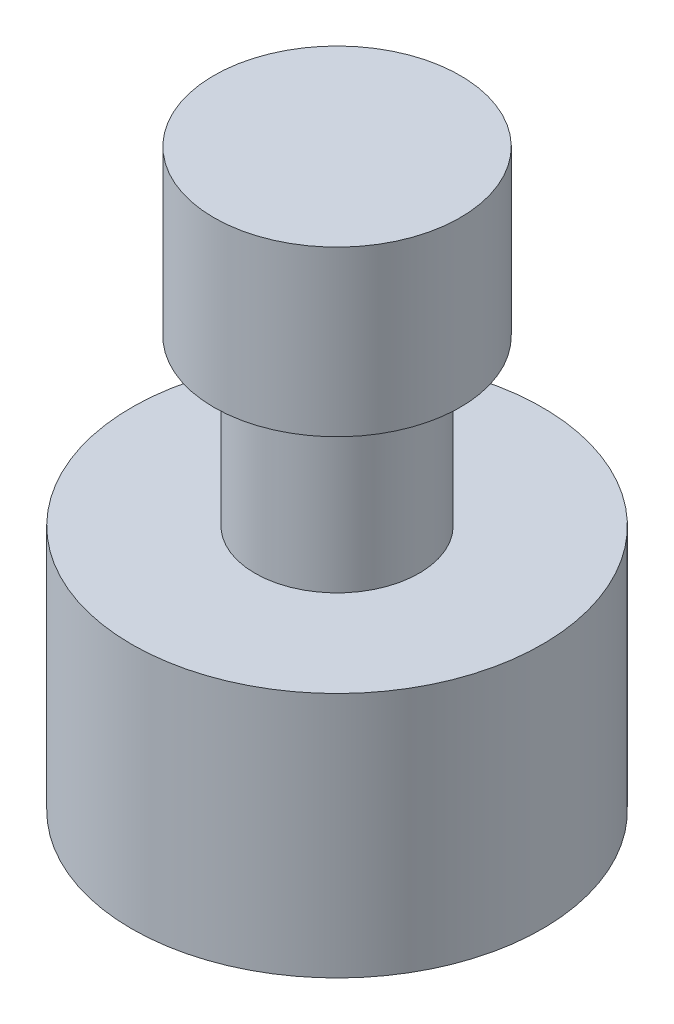
ISO-10303-21;
HEADER;
FILE_DESCRIPTION(('STEP AP214'),'2;1');
FILE_NAME('part.step','',(''),(''),'','','');
FILE_SCHEMA(('AUTOMOTIVE_DESIGN { 1 0 10303 214 1 1 1 1 }'));
ENDSEC;
DATA;
#1=APPLICATION_CONTEXT('core data for automotive mechanical design processes');
#2=APPLICATION_PROTOCOL_DEFINITION('international standard','automotive_design',2000,#1);
#3=PRODUCT_CONTEXT('',#1,'mechanical');
#4=PRODUCT('Part','Part','',(#3));
#5=PRODUCT_RELATED_PRODUCT_CATEGORY('part','',(#4));
#6=PRODUCT_DEFINITION_FORMATION('','',#4);
#7=PRODUCT_DEFINITION_CONTEXT('part definition',#1,'design');
#8=PRODUCT_DEFINITION('design','',#6,#7);
#9=PRODUCT_DEFINITION_SHAPE('','',#8);
#10=(LENGTH_UNIT() NAMED_UNIT(*) SI_UNIT(.MILLI.,.METRE.));
#11=(NAMED_UNIT(*) PLANE_ANGLE_UNIT() SI_UNIT($,.RADIAN.));
#12=(NAMED_UNIT(*) SI_UNIT($,.STERADIAN.) SOLID_ANGLE_UNIT());
#13=UNCERTAINTY_MEASURE_WITH_UNIT(LENGTH_MEASURE(1.E-05),#10,'distance_accuracy_value','');
#14=(GEOMETRIC_REPRESENTATION_CONTEXT(3) GLOBAL_UNCERTAINTY_ASSIGNED_CONTEXT((#13)) GLOBAL_UNIT_ASSIGNED_CONTEXT((#10,
#11,#12)) REPRESENTATION_CONTEXT('',''));
#15=CARTESIAN_POINT('',(0.,0.,0.));
#16=DIRECTION('',(0.,0.,1.));
#17=DIRECTION('',(1.,0.,0.));
#18=AXIS2_PLACEMENT_3D('',#15,#16,#17);
#19=CARTESIAN_POINT('',(0.,70.,0.));
#20=DIRECTION('',(0.,-1.,0.));
#21=DIRECTION('',(0.,0.,-1.));
#22=AXIS2_PLACEMENT_3D('',#19,#20,#21);
#23=PLANE('',#22);
#24=CARTESIAN_POINT('',(25.,70.,0.));
#25=DIRECTION('',(0.,1.,0.));
#26=DIRECTION('',(0.,0.,1.));
#27=AXIS2_PLACEMENT_3D('',#24,#25,#26);
#28=CIRCLE('',#27,15.);
#29=CARTESIAN_POINT('',(25.,70.,15.));
#30=VERTEX_POINT('',#29);
#31=EDGE_CURVE('E10',#30,#30,#28,.T.);
#32=ORIENTED_EDGE('',*,*,#31,.T.);
#33=EDGE_LOOP('',(#32));
#34=FACE_BOUND('',#33,.T.);
#35=ADVANCED_FACE('F37',(#34),#23,.F.);
#36=CARTESIAN_POINT('',(25.,70.,0.));
#37=DIRECTION('',(0.,1.,0.));
#38=DIRECTION('',(0.,0.,1.));
#39=AXIS2_PLACEMENT_3D('',#36,#37,#38);
#40=CYLINDRICAL_SURFACE('',#39,15.);
#41=ORIENTED_EDGE('',*,*,#31,.F.);
#42=EDGE_LOOP('',(#41));
#43=FACE_BOUND('',#42,.T.);
#44=CARTESIAN_POINT('',(25.,50.,0.));
#45=DIRECTION('',(0.,1.,0.));
#46=DIRECTION('',(0.,0.,1.));
#47=AXIS2_PLACEMENT_3D('',#44,#45,#46);
#48=CIRCLE('',#47,15.);
#49=CARTESIAN_POINT('',(25.,50.,15.));
#50=VERTEX_POINT('',#49);
#51=EDGE_CURVE('E43',#50,#50,#48,.T.);
#52=ORIENTED_EDGE('',*,*,#51,.T.);
#53=EDGE_LOOP('',(#52));
#54=FACE_BOUND('',#53,.T.);
#55=ADVANCED_FACE('F75',(#43,#54),#40,.T.);
#56=CARTESIAN_POINT('',(0.,50.,0.));
#57=DIRECTION('',(0.,-1.,0.));
#58=DIRECTION('',(0.,0.,-1.));
#59=AXIS2_PLACEMENT_3D('',#56,#57,#58);
#60=PLANE('',#59);
#61=CARTESIAN_POINT('',(25.,50.,0.));
#62=DIRECTION('',(0.,1.,0.));
#63=DIRECTION('',(0.,0.,1.));
#64=AXIS2_PLACEMENT_3D('',#61,#62,#63);
#65=CIRCLE('',#64,10.);
#66=CARTESIAN_POINT('',(25.,50.,10.));
#67=VERTEX_POINT('',#66);
#68=EDGE_CURVE('E47',#67,#67,#65,.T.);
#69=ORIENTED_EDGE('',*,*,#68,.T.);
#70=EDGE_LOOP('',(#69));
#71=FACE_BOUND('',#70,.T.);
#72=ORIENTED_EDGE('',*,*,#51,.F.);
#73=EDGE_LOOP('',(#72));
#74=FACE_BOUND('',#73,.T.);
#75=ADVANCED_FACE('F79',(#71,#74),#60,.T.);
#76=CARTESIAN_POINT('',(25.,70.,0.));
#77=DIRECTION('',(0.,1.,0.));
#78=DIRECTION('',(0.,0.,1.));
#79=AXIS2_PLACEMENT_3D('',#76,#77,#78);
#80=CYLINDRICAL_SURFACE('',#79,10.);
#81=ORIENTED_EDGE('',*,*,#68,.F.);
#82=EDGE_LOOP('',(#81));
#83=FACE_BOUND('',#82,.T.);
#84=CARTESIAN_POINT('',(25.,30.,0.));
#85=DIRECTION('',(0.,1.,0.));
#86=DIRECTION('',(0.,0.,1.));
#87=AXIS2_PLACEMENT_3D('',#84,#85,#86);
#88=CIRCLE('',#87,10.);
#89=CARTESIAN_POINT('',(25.,30.,10.));
#90=VERTEX_POINT('',#89);
#91=EDGE_CURVE('E51',#90,#90,#88,.T.);
#92=ORIENTED_EDGE('',*,*,#91,.T.);
#93=EDGE_LOOP('',(#92));
#94=FACE_BOUND('',#93,.T.);
#95=ADVANCED_FACE('F84',(#83,#94),#80,.T.);
#96=CARTESIAN_POINT('',(0.,30.,0.));
#97=DIRECTION('',(0.,-1.,0.));
#98=DIRECTION('',(0.,0.,-1.));
#99=AXIS2_PLACEMENT_3D('',#96,#97,#98);
#100=PLANE('',#99);
#101=ORIENTED_EDGE('',*,*,#91,.F.);
#102=EDGE_LOOP('',(#101));
#103=FACE_BOUND('',#102,.T.);
#104=CARTESIAN_POINT('',(25.,30.,0.));
#105=DIRECTION('',(0.,1.,0.));
#106=DIRECTION('',(0.,0.,1.));
#107=AXIS2_PLACEMENT_3D('',#104,#105,#106);
#108=CIRCLE('',#107,25.);
#109=CARTESIAN_POINT('',(25.,30.,25.));
#110=VERTEX_POINT('',#109);
#111=EDGE_CURVE('E56',#110,#110,#108,.T.);
#112=ORIENTED_EDGE('',*,*,#111,.T.);
#113=EDGE_LOOP('',(#112));
#114=FACE_BOUND('',#113,.T.);
#115=ADVANCED_FACE('F71',(#103,#114),#100,.F.);
#116=CARTESIAN_POINT('',(25.,70.,0.));
#117=DIRECTION('',(0.,1.,0.));
#118=DIRECTION('',(0.,0.,1.));
#119=AXIS2_PLACEMENT_3D('',#116,#117,#118);
#120=CYLINDRICAL_SURFACE('',#119,25.);
#121=ORIENTED_EDGE('',*,*,#111,.F.);
#122=EDGE_LOOP('',(#121));
#123=FACE_BOUND('',#122,.T.);
#124=CARTESIAN_POINT('',(25.,0.,0.));
#125=DIRECTION('',(0.,1.,0.));
#126=DIRECTION('',(0.,0.,1.));
#127=AXIS2_PLACEMENT_3D('',#124,#125,#126);
#128=CIRCLE('',#127,25.);
#129=CARTESIAN_POINT('',(25.,0.,25.));
#130=VERTEX_POINT('',#129);
#131=EDGE_CURVE('E59',#130,#130,#128,.T.);
#132=ORIENTED_EDGE('',*,*,#131,.T.);
#133=EDGE_LOOP('',(#132));
#134=FACE_BOUND('',#133,.T.);
#135=ADVANCED_FACE('F63',(#123,#134),#120,.T.);
#136=CARTESIAN_POINT('',(0.,0.,0.));
#137=DIRECTION('',(0.,-1.,0.));
#138=DIRECTION('',(0.,0.,-1.));
#139=AXIS2_PLACEMENT_3D('',#136,#137,#138);
#140=PLANE('',#139);
#141=ORIENTED_EDGE('',*,*,#131,.F.);
#142=EDGE_LOOP('',(#141));
#143=FACE_BOUND('',#142,.T.);
#144=ADVANCED_FACE('F65',(#143),#140,.T.);
#145=CLOSED_SHELL('',(#35,#55,#75,#95,#115,#135,#144));
#146=MANIFOLD_SOLID_BREP('B2',#145);
#147=ADVANCED_BREP_SHAPE_REPRESENTATION('',(#18,#146),#14);
#148=SHAPE_DEFINITION_REPRESENTATION(#9,#147);
ENDSEC;
END-ISO-10303-21;
